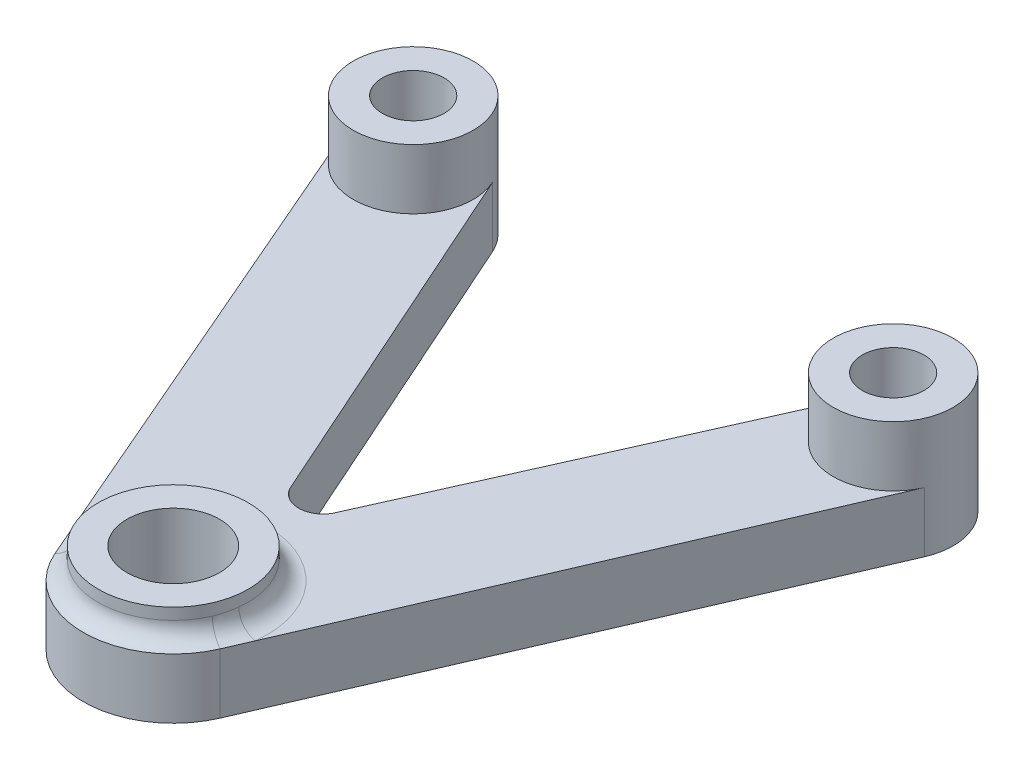
ISO-10303-21;
HEADER;
FILE_DESCRIPTION(('STEP AP214'),'2;1');
FILE_NAME('part.step','',(''),(''),'','','');
FILE_SCHEMA(('AUTOMOTIVE_DESIGN { 1 0 10303 214 1 1 1 1 }'));
ENDSEC;
DATA;
#1=APPLICATION_CONTEXT('core data for automotive mechanical design processes');
#2=APPLICATION_PROTOCOL_DEFINITION('international standard','automotive_design',2000,#1);
#3=PRODUCT_CONTEXT('',#1,'mechanical');
#4=PRODUCT('Part','Part','',(#3));
#5=PRODUCT_RELATED_PRODUCT_CATEGORY('part','',(#4));
#6=PRODUCT_DEFINITION_FORMATION('','',#4);
#7=PRODUCT_DEFINITION_CONTEXT('part definition',#1,'design');
#8=PRODUCT_DEFINITION('design','',#6,#7);
#9=PRODUCT_DEFINITION_SHAPE('','',#8);
#10=(LENGTH_UNIT() NAMED_UNIT(*) SI_UNIT(.MILLI.,.METRE.));
#11=(NAMED_UNIT(*) PLANE_ANGLE_UNIT() SI_UNIT($,.RADIAN.));
#12=(NAMED_UNIT(*) SI_UNIT($,.STERADIAN.) SOLID_ANGLE_UNIT());
#13=UNCERTAINTY_MEASURE_WITH_UNIT(LENGTH_MEASURE(1.E-05),#10,'distance_accuracy_value','');
#14=(GEOMETRIC_REPRESENTATION_CONTEXT(3) GLOBAL_UNCERTAINTY_ASSIGNED_CONTEXT((#13)) GLOBAL_UNIT_ASSIGNED_CONTEXT((#10,
#11,#12)) REPRESENTATION_CONTEXT('',''));
#15=CARTESIAN_POINT('',(0.,0.,0.));
#16=DIRECTION('',(0.,0.,1.));
#17=DIRECTION('',(1.,0.,0.));
#18=AXIS2_PLACEMENT_3D('',#15,#16,#17);
#19=CARTESIAN_POINT('',(0.,6.35,-19.1326419315339));
#20=DIRECTION('',(0.,-1.,0.));
#21=DIRECTION('',(0.,0.,-1.));
#22=AXIS2_PLACEMENT_3D('',#19,#20,#21);
#23=CYLINDRICAL_SURFACE('',#22,2.60351351052223);
#24=CARTESIAN_POINT('',(0.,0.,-19.1326419315339));
#25=DIRECTION('',(0.,1.,0.));
#26=DIRECTION('',(0.,0.,1.));
#27=AXIS2_PLACEMENT_3D('',#24,#25,#26);
#28=CIRCLE('',#27,2.60351351052223);
#29=CARTESIAN_POINT('',(-2.26024053048188,0.,-17.8405137088568));
#30=VERTEX_POINT('',#29);
#31=CARTESIAN_POINT('',(2.26024053048188,0.,-17.8405137088568));
#32=VERTEX_POINT('',#31);
#33=EDGE_CURVE('E253',#30,#32,#28,.T.);
#34=ORIENTED_EDGE('',*,*,#33,.F.);
#35=DIRECTION('',(0.,-1.,0.));
#36=VECTOR('',#35,1.);
#37=CARTESIAN_POINT('',(-2.26024053048188,6.35,-17.8405137088568));
#38=LINE('',#37,#36);
#39=CARTESIAN_POINT('',(-2.26024053048188,6.35,-17.8405137088568));
#40=VERTEX_POINT('',#39);
#41=EDGE_CURVE('E134',#40,#30,#38,.T.);
#42=ORIENTED_EDGE('',*,*,#41,.F.);
#43=CARTESIAN_POINT('',(0.,6.35,-19.1326419315339));
#44=DIRECTION('',(0.,1.,0.));
#45=DIRECTION('',(0.,0.,1.));
#46=AXIS2_PLACEMENT_3D('',#43,#44,#45);
#47=CIRCLE('',#46,2.60351351052223);
#48=CARTESIAN_POINT('',(2.26024053048188,6.35,-17.8405137088568));
#49=VERTEX_POINT('',#48);
#50=EDGE_CURVE('E141',#40,#49,#47,.T.);
#51=ORIENTED_EDGE('',*,*,#50,.T.);
#52=DIRECTION('',(0.,-1.,0.));
#53=VECTOR('',#52,1.);
#54=CARTESIAN_POINT('',(2.26024053048188,6.35,-17.8405137088568));
#55=LINE('',#54,#53);
#56=EDGE_CURVE('E254',#49,#32,#55,.T.);
#57=ORIENTED_EDGE('',*,*,#56,.T.);
#58=EDGE_LOOP('',(#34,#42,#51,#57));
#59=FACE_BOUND('',#58,.T.);
#60=ADVANCED_FACE('F39',(#59),#23,.F.);
#61=CARTESIAN_POINT('',(4.7614095283321,6.35,-2.12775872381943));
#62=DIRECTION('',(-0.912985825560001,0.,0.407991277267693));
#63=DIRECTION('',(0.407991277267693,0.,0.912985825560001));
#64=AXIS2_PLACEMENT_3D('',#61,#62,#63);
#65=PLANE('',#64);
#66=DIRECTION('',(-0.407991277267693,0.,-0.912985825560001));
#67=VECTOR('',#66,1.);
#68=CARTESIAN_POINT('',(4.7614095283321,0.,-2.12775872381943));
#69=LINE('',#68,#67);
#70=CARTESIAN_POINT('',(-19.602540007694,0.,-56.6483865421838));
#71=VERTEX_POINT('',#70);
#72=EDGE_CURVE('E130',#30,#71,#69,.T.);
#73=ORIENTED_EDGE('',*,*,#72,.T.);
#74=DIRECTION('',(0.,-1.,0.));
#75=VECTOR('',#74,1.);
#76=CARTESIAN_POINT('',(-19.602540007694,6.35,-56.6483865421838));
#77=LINE('',#76,#75);
#78=CARTESIAN_POINT('',(-19.602540007694,6.35,-56.6483865421838));
#79=VERTEX_POINT('',#78);
#80=EDGE_CURVE('E124',#79,#71,#77,.T.);
#81=ORIENTED_EDGE('',*,*,#80,.F.);
#82=DIRECTION('',(-0.407991277267693,0.,-0.912985825560001));
#83=VECTOR('',#82,1.);
#84=CARTESIAN_POINT('',(4.7614095283321,6.35,-2.12775872381943));
#85=LINE('',#84,#83);
#86=EDGE_CURVE('E127',#40,#79,#85,.T.);
#87=ORIENTED_EDGE('',*,*,#86,.F.);
#88=ORIENTED_EDGE('',*,*,#41,.T.);
#89=EDGE_LOOP('',(#73,#81,#87,#88));
#90=FACE_BOUND('',#89,.T.);
#91=ADVANCED_FACE('F126',(#90),#65,.F.);
#92=CARTESIAN_POINT('',(-25.4,6.35,-54.0576419315339));
#93=DIRECTION('',(0.,-1.,0.));
#94=DIRECTION('',(0.,0.,-1.));
#95=AXIS2_PLACEMENT_3D('',#92,#93,#94);
#96=CYLINDRICAL_SURFACE('',#95,6.35);
#97=ORIENTED_EDGE('',*,*,#80,.T.);
#98=CARTESIAN_POINT('',(-25.4,0.,-54.0576419315339));
#99=DIRECTION('',(0.,1.,0.));
#100=DIRECTION('',(0.,0.,1.));
#101=AXIS2_PLACEMENT_3D('',#98,#99,#100);
#102=CIRCLE('',#101,6.35);
#103=CARTESIAN_POINT('',(-31.2294813240886,0.,-51.5397762694896));
#104=VERTEX_POINT('',#103);
#105=EDGE_CURVE('E147',#71,#104,#102,.T.);
#106=ORIENTED_EDGE('',*,*,#105,.T.);
#107=DIRECTION('',(0.,-1.,0.));
#108=VECTOR('',#107,1.);
#109=CARTESIAN_POINT('',(-31.2294813240886,6.35,-51.5397762694896));
#110=LINE('',#109,#108);
#111=CARTESIAN_POINT('',(-31.2294813240886,6.35,-51.5397762694896));
#112=VERTEX_POINT('',#111);
#113=EDGE_CURVE('E135',#112,#104,#110,.T.);
#114=ORIENTED_EDGE('',*,*,#113,.F.);
#115=CARTESIAN_POINT('',(-25.4,6.35,-54.0576419315339));
#116=DIRECTION('',(0.,1.,0.));
#117=DIRECTION('',(0.,0.,1.));
#118=AXIS2_PLACEMENT_3D('',#115,#116,#117);
#119=CIRCLE('',#118,6.34999999999999);
#120=EDGE_CURVE('E11',#112,#79,#119,.T.);
#121=ORIENTED_EDGE('',*,*,#120,.T.);
#122=EDGE_LOOP('',(#97,#106,#114,#121));
#123=FACE_BOUND('',#122,.T.);
#124=CARTESIAN_POINT('',(-25.4,12.7,-54.0576419315339));
#125=DIRECTION('',(0.,1.,0.));
#126=DIRECTION('',(0.,0.,1.));
#127=AXIS2_PLACEMENT_3D('',#124,#125,#126);
#128=CIRCLE('',#127,6.34999999999999);
#129=CARTESIAN_POINT('',(-25.4,12.7,-47.7076419315339));
#130=VERTEX_POINT('',#129);
#131=EDGE_CURVE('E337',#130,#130,#128,.T.);
#132=ORIENTED_EDGE('',*,*,#131,.F.);
#133=EDGE_LOOP('',(#132));
#134=FACE_BOUND('',#133,.T.);
#135=ADVANCED_FACE('F145',(#123,#134),#96,.T.);
#136=CARTESIAN_POINT('',(-7.55840309085105,6.35,3.26462039147518));
#137=DIRECTION('',(0.918028554974588,0.,-0.396514277487294));
#138=DIRECTION('',(-0.396514277487294,0.,-0.918028554974588));
#139=AXIS2_PLACEMENT_3D('',#136,#137,#138);
#140=PLANE('',#139);
#141=DIRECTION('',(0.396514277487294,0.,0.918028554974588));
#142=VECTOR('',#141,1.);
#143=CARTESIAN_POINT('',(-7.55840309085105,0.,3.26462039147518));
#144=LINE('',#143,#142);
#145=CARTESIAN_POINT('',(-8.74422198613295,0.,0.519156561532535));
#146=VERTEX_POINT('',#145);
#147=EDGE_CURVE('E269',#104,#146,#144,.T.);
#148=ORIENTED_EDGE('',*,*,#147,.T.);
#149=DIRECTION('',(0.,-1.,0.));
#150=VECTOR('',#149,1.);
#151=CARTESIAN_POINT('',(-8.74422198613295,6.35,0.519156561532535));
#152=LINE('',#151,#150);
#153=CARTESIAN_POINT('',(-8.74422198613295,6.35,0.519156561532535));
#154=VERTEX_POINT('',#153);
#155=EDGE_CURVE('E151',#154,#146,#152,.T.);
#156=ORIENTED_EDGE('',*,*,#155,.F.);
#157=DIRECTION('',(0.396514277487294,0.,0.918028554974588));
#158=VECTOR('',#157,1.);
#159=CARTESIAN_POINT('',(-7.55840309085105,6.35,3.26462039147518));
#160=LINE('',#159,#158);
#161=CARTESIAN_POINT('',(-9.867714334644,6.35,-2.08200590798701));
#162=VERTEX_POINT('',#161);
#163=EDGE_CURVE('E142',#162,#154,#160,.T.);
#164=ORIENTED_EDGE('',*,*,#163,.F.);
#165=EDGE_CURVE('E320',#112,#162,#160,.T.);
#166=ORIENTED_EDGE('',*,*,#165,.F.);
#167=ORIENTED_EDGE('',*,*,#113,.T.);
#168=EDGE_LOOP('',(#148,#156,#164,#166,#167));
#169=FACE_BOUND('',#168,.T.);
#170=ADVANCED_FACE('F235',(#169),#140,.F.);
#171=CARTESIAN_POINT('',(0.,6.35,-3.25764193153394));
#172=DIRECTION('',(0.,-1.,0.));
#173=DIRECTION('',(0.,0.,-1.));
#174=AXIS2_PLACEMENT_3D('',#171,#172,#173);
#175=CYLINDRICAL_SURFACE('',#174,9.52500000000001);
#176=CARTESIAN_POINT('',(0.,0.,-3.25764193153394));
#177=DIRECTION('',(0.,1.,0.));
#178=DIRECTION('',(0.,0.,1.));
#179=AXIS2_PLACEMENT_3D('',#176,#177,#178);
#180=CIRCLE('',#179,9.52500000000001);
#181=CARTESIAN_POINT('',(8.74422198613295,0.,0.519156561532535));
#182=VERTEX_POINT('',#181);
#183=EDGE_CURVE('E271',#146,#182,#180,.T.);
#184=ORIENTED_EDGE('',*,*,#183,.T.);
#185=DIRECTION('',(0.,-1.,0.));
#186=VECTOR('',#185,1.);
#187=CARTESIAN_POINT('',(8.74422198613295,6.35,0.519156561532535));
#188=LINE('',#187,#186);
#189=CARTESIAN_POINT('',(8.74422198613295,6.35,0.519156561532535));
#190=VERTEX_POINT('',#189);
#191=EDGE_CURVE('E154',#190,#182,#188,.T.);
#192=ORIENTED_EDGE('',*,*,#191,.F.);
#193=CARTESIAN_POINT('',(0.,6.35,-3.25764193153394));
#194=DIRECTION('',(0.,1.,0.));
#195=DIRECTION('',(0.,0.,1.));
#196=AXIS2_PLACEMENT_3D('',#193,#194,#195);
#197=CIRCLE('',#196,9.52500000000001);
#198=EDGE_CURVE('E309',#154,#190,#197,.T.);
#199=ORIENTED_EDGE('',*,*,#198,.F.);
#200=ORIENTED_EDGE('',*,*,#155,.T.);
#201=EDGE_LOOP('',(#184,#192,#199,#200));
#202=FACE_BOUND('',#201,.T.);
#203=ADVANCED_FACE('F240',(#202),#175,.T.);
#204=CARTESIAN_POINT('',(7.55840309085105,6.35,3.26462039147518));
#205=DIRECTION('',(0.918028554974588,0.,0.396514277487294));
#206=DIRECTION('',(0.396514277487294,0.,-0.918028554974588));
#207=AXIS2_PLACEMENT_3D('',#204,#205,#206);
#208=PLANE('',#207);
#209=DIRECTION('',(-0.396514277487294,0.,0.918028554974588));
#210=VECTOR('',#209,1.);
#211=CARTESIAN_POINT('',(7.55840309085105,0.,3.26462039147518));
#212=LINE('',#211,#210);
#213=CARTESIAN_POINT('',(31.2294813240886,0.,-51.5397762694896));
#214=VERTEX_POINT('',#213);
#215=EDGE_CURVE('E274',#214,#182,#212,.T.);
#216=ORIENTED_EDGE('',*,*,#215,.F.);
#217=DIRECTION('',(0.,-1.,0.));
#218=VECTOR('',#217,1.);
#219=CARTESIAN_POINT('',(31.2294813240886,6.35,-51.5397762694896));
#220=LINE('',#219,#218);
#221=CARTESIAN_POINT('',(31.2294813240886,6.35,-51.5397762694896));
#222=VERTEX_POINT('',#221);
#223=EDGE_CURVE('E285',#222,#214,#220,.T.);
#224=ORIENTED_EDGE('',*,*,#223,.F.);
#225=DIRECTION('',(-0.396514277487294,0.,0.918028554974588));
#226=VECTOR('',#225,1.);
#227=CARTESIAN_POINT('',(7.55840309085105,6.35,3.26462039147518));
#228=LINE('',#227,#226);
#229=CARTESIAN_POINT('',(9.867714334644,6.35,-2.08200590798701));
#230=VERTEX_POINT('',#229);
#231=EDGE_CURVE('E301',#222,#230,#228,.T.);
#232=ORIENTED_EDGE('',*,*,#231,.T.);
#233=EDGE_CURVE('E292',#230,#190,#228,.T.);
#234=ORIENTED_EDGE('',*,*,#233,.T.);
#235=ORIENTED_EDGE('',*,*,#191,.T.);
#236=EDGE_LOOP('',(#216,#224,#232,#234,#235));
#237=FACE_BOUND('',#236,.T.);
#238=ADVANCED_FACE('F289',(#237),#208,.T.);
#239=CARTESIAN_POINT('',(25.4,6.35,-54.0576419315339));
#240=DIRECTION('',(0.,-1.,0.));
#241=DIRECTION('',(0.,0.,-1.));
#242=AXIS2_PLACEMENT_3D('',#239,#240,#241);
#243=CYLINDRICAL_SURFACE('',#242,6.35);
#244=ORIENTED_EDGE('',*,*,#223,.T.);
#245=CARTESIAN_POINT('',(25.4,0.,-54.0576419315339));
#246=DIRECTION('',(0.,1.,0.));
#247=DIRECTION('',(0.,0.,1.));
#248=AXIS2_PLACEMENT_3D('',#245,#246,#247);
#249=CIRCLE('',#248,6.35);
#250=CARTESIAN_POINT('',(19.602540007694,0.,-56.6483865421838));
#251=VERTEX_POINT('',#250);
#252=EDGE_CURVE('E277',#251,#214,#249,.F.);
#253=ORIENTED_EDGE('',*,*,#252,.F.);
#254=DIRECTION('',(0.,-1.,0.));
#255=VECTOR('',#254,1.);
#256=CARTESIAN_POINT('',(19.602540007694,6.35,-56.6483865421838));
#257=LINE('',#256,#255);
#258=CARTESIAN_POINT('',(19.602540007694,6.35,-56.6483865421838));
#259=VERTEX_POINT('',#258);
#260=EDGE_CURVE('E283',#259,#251,#257,.T.);
#261=ORIENTED_EDGE('',*,*,#260,.F.);
#262=CARTESIAN_POINT('',(25.4,6.35,-54.0576419315339));
#263=DIRECTION('',(0.,1.,0.));
#264=DIRECTION('',(0.,0.,1.));
#265=AXIS2_PLACEMENT_3D('',#262,#263,#264);
#266=CIRCLE('',#265,6.35);
#267=EDGE_CURVE('E47',#259,#222,#266,.T.);
#268=ORIENTED_EDGE('',*,*,#267,.T.);
#269=EDGE_LOOP('',(#244,#253,#261,#268));
#270=FACE_BOUND('',#269,.T.);
#271=CARTESIAN_POINT('',(25.4,12.7,-54.0576419315339));
#272=DIRECTION('',(0.,1.,0.));
#273=DIRECTION('',(0.,0.,1.));
#274=AXIS2_PLACEMENT_3D('',#271,#272,#273);
#275=CIRCLE('',#274,6.35);
#276=CARTESIAN_POINT('',(25.4,12.7,-47.7076419315339));
#277=VERTEX_POINT('',#276);
#278=EDGE_CURVE('E214',#277,#277,#275,.T.);
#279=ORIENTED_EDGE('',*,*,#278,.F.);
#280=EDGE_LOOP('',(#279));
#281=FACE_BOUND('',#280,.T.);
#282=ADVANCED_FACE('F298',(#270,#281),#243,.T.);
#283=CARTESIAN_POINT('',(-4.7614095283321,6.35,-2.12775872381943));
#284=DIRECTION('',(-0.912985825560001,0.,-0.407991277267693));
#285=DIRECTION('',(-0.407991277267693,0.,0.912985825560001));
#286=AXIS2_PLACEMENT_3D('',#283,#284,#285);
#287=PLANE('',#286);
#288=DIRECTION('',(0.407991277267693,0.,-0.912985825560001));
#289=VECTOR('',#288,1.);
#290=CARTESIAN_POINT('',(-4.7614095283321,0.,-2.12775872381943));
#291=LINE('',#290,#289);
#292=EDGE_CURVE('E280',#32,#251,#291,.T.);
#293=ORIENTED_EDGE('',*,*,#292,.F.);
#294=ORIENTED_EDGE('',*,*,#56,.F.);
#295=DIRECTION('',(0.407991277267693,0.,-0.912985825560001));
#296=VECTOR('',#295,1.);
#297=CARTESIAN_POINT('',(-4.7614095283321,6.35,-2.12775872381943));
#298=LINE('',#297,#296);
#299=EDGE_CURVE('E265',#49,#259,#298,.T.);
#300=ORIENTED_EDGE('',*,*,#299,.T.);
#301=ORIENTED_EDGE('',*,*,#260,.T.);
#302=EDGE_LOOP('',(#293,#294,#300,#301));
#303=FACE_BOUND('',#302,.T.);
#304=ADVANCED_FACE('F453',(#303),#287,.T.);
#305=CARTESIAN_POINT('',(0.,6.35,0.));
#306=DIRECTION('',(0.,1.,0.));
#307=DIRECTION('',(0.,0.,1.));
#308=AXIS2_PLACEMENT_3D('',#305,#306,#307);
#309=PLANE('',#308);
#310=ORIENTED_EDGE('',*,*,#120,.F.);
#311=ORIENTED_EDGE('',*,*,#165,.T.);
#312=CARTESIAN_POINT('',(0.,6.35,-3.25764193153394));
#313=DIRECTION('',(0.,1.,0.));
#314=DIRECTION('',(0.,0.,1.));
#315=AXIS2_PLACEMENT_3D('',#312,#313,#314);
#316=CIRCLE('',#315,9.9375);
#317=EDGE_CURVE('E54',#162,#230,#316,.F.);
#318=ORIENTED_EDGE('',*,*,#317,.T.);
#319=ORIENTED_EDGE('',*,*,#231,.F.);
#320=ORIENTED_EDGE('',*,*,#267,.F.);
#321=ORIENTED_EDGE('',*,*,#299,.F.);
#322=ORIENTED_EDGE('',*,*,#50,.F.);
#323=ORIENTED_EDGE('',*,*,#86,.T.);
#324=EDGE_LOOP('',(#310,#311,#318,#319,#320,#321,#322,#323));
#325=FACE_BOUND('',#324,.T.);
#326=ADVANCED_FACE('F137',(#325),#309,.T.);
#327=CARTESIAN_POINT('',(0.,0.,0.));
#328=DIRECTION('',(0.,1.,0.));
#329=DIRECTION('',(0.,0.,1.));
#330=AXIS2_PLACEMENT_3D('',#327,#328,#329);
#331=PLANE('',#330);
#332=CARTESIAN_POINT('',(0.,0.,-3.25764193153394));
#333=DIRECTION('',(0.,1.,0.));
#334=DIRECTION('',(0.,0.,1.));
#335=AXIS2_PLACEMENT_3D('',#332,#333,#334);
#336=CIRCLE('',#335,4.90219999999999);
#337=CARTESIAN_POINT('',(0.,0.,1.64455806846605));
#338=VERTEX_POINT('',#337);
#339=EDGE_CURVE('E314',#338,#338,#336,.T.);
#340=ORIENTED_EDGE('',*,*,#339,.T.);
#341=EDGE_LOOP('',(#340));
#342=FACE_BOUND('',#341,.T.);
#343=CARTESIAN_POINT('',(-25.4,0.,-54.0576419315339));
#344=DIRECTION('',(0.,1.,0.));
#345=DIRECTION('',(0.,0.,1.));
#346=AXIS2_PLACEMENT_3D('',#343,#344,#345);
#347=CIRCLE('',#346,3.2639);
#348=CARTESIAN_POINT('',(-25.4,0.,-50.7937419315339));
#349=VERTEX_POINT('',#348);
#350=EDGE_CURVE('E262',#349,#349,#347,.T.);
#351=ORIENTED_EDGE('',*,*,#350,.T.);
#352=EDGE_LOOP('',(#351));
#353=FACE_BOUND('',#352,.T.);
#354=CARTESIAN_POINT('',(25.4,0.,-54.0576419315339));
#355=DIRECTION('',(0.,1.,0.));
#356=DIRECTION('',(0.,0.,1.));
#357=AXIS2_PLACEMENT_3D('',#354,#355,#356);
#358=CIRCLE('',#357,3.2639);
#359=CARTESIAN_POINT('',(25.4,0.,-50.7937419315339));
#360=VERTEX_POINT('',#359);
#361=EDGE_CURVE('E258',#360,#360,#358,.T.);
#362=ORIENTED_EDGE('',*,*,#361,.T.);
#363=EDGE_LOOP('',(#362));
#364=FACE_BOUND('',#363,.T.);
#365=ORIENTED_EDGE('',*,*,#33,.T.);
#366=ORIENTED_EDGE('',*,*,#292,.T.);
#367=ORIENTED_EDGE('',*,*,#252,.T.);
#368=ORIENTED_EDGE('',*,*,#215,.T.);
#369=ORIENTED_EDGE('',*,*,#183,.F.);
#370=ORIENTED_EDGE('',*,*,#147,.F.);
#371=ORIENTED_EDGE('',*,*,#105,.F.);
#372=ORIENTED_EDGE('',*,*,#72,.F.);
#373=EDGE_LOOP('',(#365,#366,#367,#368,#369,#370,#371,#372));
#374=FACE_BOUND('',#373,.T.);
#375=ADVANCED_FACE('F296',(#342,#353,#364,#374),#331,.F.);
#376=CARTESIAN_POINT('',(25.4,6.35,-54.0576419315339));
#377=DIRECTION('',(0.,1.,0.));
#378=DIRECTION('',(0.,0.,1.));
#379=AXIS2_PLACEMENT_3D('',#376,#377,#378);
#380=CYLINDRICAL_SURFACE('',#379,3.2639);
#381=CARTESIAN_POINT('',(25.4,12.7,-54.0576419315339));
#382=DIRECTION('',(0.,1.,0.));
#383=DIRECTION('',(0.,0.,1.));
#384=AXIS2_PLACEMENT_3D('',#381,#382,#383);
#385=CIRCLE('',#384,3.2639);
#386=CARTESIAN_POINT('',(25.4,12.7,-50.7937419315339));
#387=VERTEX_POINT('',#386);
#388=EDGE_CURVE('E334',#387,#387,#385,.T.);
#389=ORIENTED_EDGE('',*,*,#388,.T.);
#390=EDGE_LOOP('',(#389));
#391=FACE_BOUND('',#390,.T.);
#392=ORIENTED_EDGE('',*,*,#361,.F.);
#393=EDGE_LOOP('',(#392));
#394=FACE_BOUND('',#393,.T.);
#395=ADVANCED_FACE('F376',(#391,#394),#380,.F.);
#396=CARTESIAN_POINT('',(-25.4,6.35,-54.0576419315339));
#397=DIRECTION('',(0.,1.,0.));
#398=DIRECTION('',(0.,0.,1.));
#399=AXIS2_PLACEMENT_3D('',#396,#397,#398);
#400=CYLINDRICAL_SURFACE('',#399,3.2639);
#401=CARTESIAN_POINT('',(-25.4,12.7,-54.0576419315339));
#402=DIRECTION('',(0.,1.,0.));
#403=DIRECTION('',(0.,0.,1.));
#404=AXIS2_PLACEMENT_3D('',#401,#402,#403);
#405=CIRCLE('',#404,3.2639);
#406=CARTESIAN_POINT('',(-25.4,12.7,-50.7937419315339));
#407=VERTEX_POINT('',#406);
#408=EDGE_CURVE('E340',#407,#407,#405,.T.);
#409=ORIENTED_EDGE('',*,*,#408,.T.);
#410=EDGE_LOOP('',(#409));
#411=FACE_BOUND('',#410,.T.);
#412=ORIENTED_EDGE('',*,*,#350,.F.);
#413=EDGE_LOOP('',(#412));
#414=FACE_BOUND('',#413,.T.);
#415=ADVANCED_FACE('F344',(#411,#414),#400,.F.);
#416=CARTESIAN_POINT('',(0.,9.525,-3.25764193153394));
#417=DIRECTION('',(0.,-1.,0.));
#418=DIRECTION('',(0.,0.,-1.));
#419=AXIS2_PLACEMENT_3D('',#416,#417,#418);
#420=CYLINDRICAL_SURFACE('',#419,7.9375);
#421=CARTESIAN_POINT('',(0.,8.35,-3.25764193153394));
#422=DIRECTION('',(0.,1.,0.));
#423=DIRECTION('',(0.,0.,1.));
#424=AXIS2_PLACEMENT_3D('',#421,#422,#423);
#425=CIRCLE('',#424,7.9375);
#426=CARTESIAN_POINT('',(7.88175924842634,8.35,-2.3186119001474));
#427=VERTEX_POINT('',#426);
#428=CARTESIAN_POINT('',(-7.88175924842634,8.35,-2.3186119001474));
#429=VERTEX_POINT('',#428);
#430=EDGE_CURVE('E159',#427,#429,#425,.T.);
#431=ORIENTED_EDGE('',*,*,#430,.T.);
#432=CARTESIAN_POINT('',(-7.92321061865644,8.34168497496145,-2.78157497992963));
#433=CARTESIAN_POINT('',(-7.91913868807956,6.163454674835,-2.71380559691229));
#434=CARTESIAN_POINT('',(-10.0868601345559,6.35,-2.5893825989268));
#435=CARTESIAN_POINT('',(-7.91669546929499,8.34589950342088,-2.67310379136009));
#436=CARTESIAN_POINT('',(-7.9131042779648,6.21341907660837,-2.62774990594332));
#437=CARTESIAN_POINT('',(-10.0361440329662,6.35,-2.47196228873919));
#438=CARTESIAN_POINT('',(-7.90794662079986,8.34829486296564,-2.56474024336233));
#439=CARTESIAN_POINT('',(-7.90529815447626,6.25889680312374,-2.53632754715262));
#440=CARTESIAN_POINT('',(-9.98503730748947,6.35,-2.35363758770654));
#441=CARTESIAN_POINT('',(-7.88600715792508,8.35040380857174,-2.34846714208903));
#442=CARTESIAN_POINT('',(-7.88566627573058,6.34063042595973,-2.34736387152889));
#443=CARTESIAN_POINT('',(-9.88215644335452,6.35,-2.11544295916792));
#444=CARTESIAN_POINT('',(-7.87281746369545,8.35011794985631,-2.2405574994495));
#445=CARTESIAN_POINT('',(-7.87389448177011,6.37717510325908,-2.24969767242746));
#446=CARTESIAN_POINT('',(-9.83038244509173,6.35,-1.99557335671212));
#447=CARTESIAN_POINT('',(-7.84202122626159,8.34782212550529,-2.0253998092539));
#448=CARTESIAN_POINT('',(-7.84580996391774,6.44235145610592,-2.05028102463539));
#449=CARTESIAN_POINT('',(-9.72626654989119,6.35,-1.75451932600602));
#450=CARTESIAN_POINT('',(-7.82441525759023,8.34581238405506,-1.91815167749699));
#451=CARTESIAN_POINT('',(-7.82953720351223,6.4711981551057,-1.94834464616127));
#452=CARTESIAN_POINT('',(-9.67392472767099,6.35,-1.63333507074527));
#453=CARTESIAN_POINT('',(-7.78481952756381,8.34085312705979,-1.70448384499291));
#454=CARTESIAN_POINT('',(-7.79221831870739,6.52217682757576,-1.74189023648997));
#455=CARTESIAN_POINT('',(-9.56875572359912,6.35,-1.3898428327153));
#456=CARTESIAN_POINT('',(-7.76282954840791,8.3379035648194,-1.59806418567789));
#457=CARTESIAN_POINT('',(-7.77119072331872,6.54446445080352,-1.63714895520172));
#458=CARTESIAN_POINT('',(-9.51592851775767,6.35,-1.26753479440381));
#459=CARTESIAN_POINT('',(-7.69160307763475,8.32886364594183,-1.28586860197355));
#460=CARTESIAN_POINT('',(-7.70229177367304,6.60141651347303,-1.32805420148421));
#461=CARTESIAN_POINT('',(-9.35963121630324,6.35,-0.905667911047432));
#462=CARTESIAN_POINT('',(-7.63628636185011,8.32244439072282,-1.08145042152646));
#463=CARTESIAN_POINT('',(-7.64711658146589,6.62899253376005,-1.11877734738483));
#464=CARTESIAN_POINT('',(-9.25558306147864,6.35,-0.664770716054334));
#465=CARTESIAN_POINT('',(-7.50949636172234,8.31244926514031,-0.677691024727496));
#466=CARTESIAN_POINT('',(-7.51830077946592,6.66741930252371,-0.702923726873053));
#467=CARTESIAN_POINT('',(-9.04662023880275,6.35,-0.180970134243739));
#468=CARTESIAN_POINT('',(-7.43802530349917,8.30887300330967,-0.478349113056965));
#469=CARTESIAN_POINT('',(-7.44429242472927,6.67864614601979,-0.4944131857377));
#470=CARTESIAN_POINT('',(-8.94170569226044,6.35,0.0619329717134883));
#471=CARTESIAN_POINT('',(-7.27759134540718,8.30624467153017,-0.0815779918430826));
#472=CARTESIAN_POINT('',(-7.27746303764007,6.68702707366524,-0.0806848052865282));
#473=CARTESIAN_POINT('',(-8.72930520060399,6.35,0.553692606869403));
#474=CARTESIAN_POINT('',(-7.18827125898213,8.30729614151715,0.115707415695912));
#475=CARTESIAN_POINT('',(-7.18350048928545,6.6839388206529,0.126367233187051));
#476=CARTESIAN_POINT('',(-8.62181448226827,6.35,0.802560187255787));
#477=CARTESIAN_POINT('',(-6.99380147766085,8.31367002836996,0.502341595259835));
#478=CARTESIAN_POINT('',(-6.98057424756784,6.66257354182981,0.527456274366948));
#479=CARTESIAN_POINT('',(-8.40733413152436,6.35,1.29913521025779));
#480=CARTESIAN_POINT('',(-6.88864837551744,8.31899336560701,0.691688647719607));
#481=CARTESIAN_POINT('',(-6.87052082186305,6.64408479237901,0.72334309865922));
#482=CARTESIAN_POINT('',(-8.30034461209605,6.35,1.54684239129706));
#483=CARTESIAN_POINT('',(-6.71808545993844,8.32810992233046,0.971258570971318));
#484=CARTESIAN_POINT('',(-6.69664084303055,6.60224305209462,1.0053975875876));
#485=CARTESIAN_POINT('',(-8.13936254789053,6.35,1.91955565830962));
#486=CARTESIAN_POINT('',(-6.65821047534579,8.33138865075115,1.06491466030385));
#487=CARTESIAN_POINT('',(-6.63573322142623,6.58542617568186,1.09950393271659));
#488=CARTESIAN_POINT('',(-8.08489484948495,6.35,2.04566184237174));
#489=CARTESIAN_POINT('',(-6.5345755249812,8.33769375367214,1.24963853909491));
#490=CARTESIAN_POINT('',(-6.51179069828715,6.54605623383036,1.28266453158733));
#491=CARTESIAN_POINT('',(-7.97637430510394,6.35,2.2969137245851));
#492=CARTESIAN_POINT('',(-6.47081562855001,8.34072013267427,1.34070637470798));
#493=CARTESIAN_POINT('',(-6.44856801290175,6.5233856138002,1.37190250775745));
#494=CARTESIAN_POINT('',(-7.92232145174343,6.35,2.42205943983464));
#495=CARTESIAN_POINT('',(-6.33952710403949,8.34581103222199,1.5200827181101));
#496=CARTESIAN_POINT('',(-6.32100654854449,6.47135197629328,1.54457589347108));
#497=CARTESIAN_POINT('',(-7.81473142260151,6.35,2.67115694928308));
#498=CARTESIAN_POINT('',(-6.27199901133334,8.34787568901831,1.60839161511334));
#499=CARTESIAN_POINT('',(-6.25647985730434,6.44182334118269,1.62816135252568));
#500=CARTESIAN_POINT('',(-7.76119417482549,6.35,2.7951089101673));
#501=CARTESIAN_POINT('',(-6.13328130206403,8.35015864871548,1.7821129986339));
#502=CARTESIAN_POINT('',(-6.12771818956425,6.37496267548846,1.78873933219677));
#503=CARTESIAN_POINT('',(-7.65471893231998,6.35,3.04162541302142));
#504=CARTESIAN_POINT('',(-6.06209132860346,8.35037677130347,1.86752520147983));
#505=CARTESIAN_POINT('',(-6.06331064635676,6.33740051713674,1.86583702347335));
#506=CARTESIAN_POINT('',(-7.60178099661699,6.35,3.16418981833042));
#507=CARTESIAN_POINT('',(-5.9891347469578,8.34922873114747,1.95140512457745));
#508=CARTESIAN_POINT('',(-6.00048889428218,6.29566015540645,1.93835062199185));
#509=CARTESIAN_POINT('',(-7.54919363073877,6.35,3.28594256784812));
#510=(BOUNDED_SURFACE() B_SPLINE_SURFACE(3,2,((#432,#433,#434),(#435,#436,#437),(#438,#439,
#440),(#441,#442,#443),(#444,#445,#446),(#447,#448,#449),(#450,#451,#452),(#453,#454,#455),
(#456,#457,#458),(#459,#460,#461),(#462,#463,#464),(#465,#466,#467),(#468,#469,#470),(#471,#472,
#473),(#474,#475,#476),(#477,#478,#479),(#480,#481,#482),(#483,#484,#485),(#486,#487,#488),
(#489,#490,#491),(#492,#493,#494),(#495,#496,#497),(#498,#499,#500),(#501,#502,#503),(#504,#505,
#506),(#507,#508,#509)),.UNSPECIFIED.,.F.,.F.,.F.) B_SPLINE_SURFACE_WITH_KNOTS((4,2,2,2,2,2,2,2,
2,2,2,2,4),(3,3),(0.,0.408263380677385,0.8164422205645,1.22456798616005,1.63271403279515,
2.42741439126504,3.22200530418352,4.03446351166703,4.8470968097908,5.26461703766217,
5.68212981550668,6.09958342476916,6.51707779763496),(0.,1.),
.UNSPECIFIED.) GEOMETRIC_REPRESENTATION_ITEM() RATIONAL_B_SPLINE_SURFACE(((1.,0.676150585185413,
1.),(1.,0.684050480555318,1.),(1.,0.691486421178658,1.),(1.,0.705427060470186,1.),(1.,
0.711931951655654,1.),(1.,0.724009647597399,1.),(1.,0.729582573440149,1.),(1.,0.739796999220544,
1.),(1.,0.744438452858975,1.),(1.,0.75674466269119,1.),(1.,0.763109423634441,1.),(1.,
0.772291998072278,1.),(1.,0.775110299929152,1.),(1.,0.777218114457058,1.),(1.,0.776426853216889,
1.),(1.,0.771131236278913,1.),(1.,0.766626080419051,1.),(1.,0.757006847537017,1.),(1.,
0.75325386983366,1.),(1.,0.744772217589826,1.),(1.,0.740043560460402,1.),(1.,0.729612125886046,
1.),(1.,0.723909486585314,1.),(1.,0.711529727985193,1.),(1.,0.704852513583941,1.),(1.,
0.697688620204205,1.))) REPRESENTATION_ITEM('') SURFACE());
#511=CARTESIAN_POINT('',(-7.92321061865644,8.34168497496145,-2.78157497992963));
#512=CARTESIAN_POINT('',(-7.91669546929499,8.34589950342088,-2.67310379136009));
#513=CARTESIAN_POINT('',(-7.90794662079986,8.34829486296564,-2.56474024336233));
#514=CARTESIAN_POINT('',(-7.88600715792508,8.35040380857174,-2.34846714208903));
#515=CARTESIAN_POINT('',(-7.87281746369545,8.35011794985631,-2.2405574994495));
#516=CARTESIAN_POINT('',(-7.84202122626159,8.34782212550529,-2.0253998092539));
#517=CARTESIAN_POINT('',(-7.82441525759023,8.34581238405506,-1.91815167749699));
#518=CARTESIAN_POINT('',(-7.78481952756381,8.34085312705979,-1.70448384499291));
#519=CARTESIAN_POINT('',(-7.76282954840791,8.3379035648194,-1.59806418567789));
#520=CARTESIAN_POINT('',(-7.69160307763475,8.32886364594183,-1.28586860197355));
#521=CARTESIAN_POINT('',(-7.63628636185011,8.32244439072282,-1.08145042152646));
#522=CARTESIAN_POINT('',(-7.50949636172234,8.31244926514031,-0.677691024727496));
#523=CARTESIAN_POINT('',(-7.43802530349917,8.30887300330967,-0.478349113056965));
#524=CARTESIAN_POINT('',(-7.27759134540718,8.30624467153017,-0.0815779918430826));
#525=CARTESIAN_POINT('',(-7.18827125898213,8.30729614151715,0.115707415695912));
#526=CARTESIAN_POINT('',(-6.99380147766085,8.31367002836996,0.502341595259835));
#527=CARTESIAN_POINT('',(-6.88864837551744,8.31899336560701,0.691688647719607));
#528=CARTESIAN_POINT('',(-6.71808545993844,8.32810992233046,0.971258570971318));
#529=CARTESIAN_POINT('',(-6.65821047534579,8.33138865075115,1.06491466030385));
#530=CARTESIAN_POINT('',(-6.5345755249812,8.33769375367214,1.24963853909491));
#531=CARTESIAN_POINT('',(-6.47081562855001,8.34072013267428,1.34070637470798));
#532=CARTESIAN_POINT('',(-6.33952710403949,8.34581103222199,1.5200827181101));
#533=CARTESIAN_POINT('',(-6.27199901133334,8.34787568901831,1.60839161511334));
#534=CARTESIAN_POINT('',(-6.13328130206403,8.35015864871548,1.7821129986339));
#535=CARTESIAN_POINT('',(-6.06209132860346,8.35037677130347,1.86752520147983));
#536=CARTESIAN_POINT('',(-5.9891347469578,8.34922873114747,1.95140512457745));
#537=B_SPLINE_CURVE_WITH_KNOTS('',3,(#511,#512,#513,#514,#515,#516,#517,#518,#519,#520,#521,
#522,#523,#524,#525,#526,#527,#528,#529,#530,#531,#532,#533,#534,#535,#536),.UNSPECIFIED.,.F.,
.F.,(4,2,2,2,2,2,2,2,2,2,2,2,4),(0.,0.408263380677385,0.8164422205645,1.22456798616005,
1.63271403279515,2.42741439126504,3.22200530418352,4.03446351166703,4.8470968097908,
5.26461703766217,5.68212981550668,6.09958342476916,6.51707779763496),.UNSPECIFIED.);
#538=CARTESIAN_POINT('',(-7.28685165511079,8.30699865866076,-0.110309853978547));
#539=VERTEX_POINT('',#538);
#540=EDGE_CURVE('E205',#429,#539,#537,.T.);
#541=ORIENTED_EDGE('',*,*,#540,.T.);
#542=CARTESIAN_POINT('',(0.,8.30699865866076,-3.25764193153394));
#543=DIRECTION('',(0.,-1.,0.));
#544=DIRECTION('',(0.,0.,-1.));
#545=AXIS2_PLACEMENT_3D('',#542,#543,#544);
#546=CIRCLE('',#545,7.9375);
#547=CARTESIAN_POINT('',(7.28685165511079,8.30699865866076,-0.110309853978548));
#548=VERTEX_POINT('',#547);
#549=EDGE_CURVE('E168',#539,#548,#546,.F.);
#550=ORIENTED_EDGE('',*,*,#549,.T.);
#551=CARTESIAN_POINT('',(5.77836728721352,8.34168497496146,2.1842674525022));
#552=CARTESIAN_POINT('',(5.82491342351387,6.16345467483504,2.13484349992168));
#553=CARTESIAN_POINT('',(7.40158383771003,6.35,3.62769572199177));
#554=CARTESIAN_POINT('',(5.85190391797342,8.34584580003975,2.10618752479129));
#555=CARTESIAN_POINT('',(5.88267445321084,6.21277697448066,2.07226672709852));
#556=CARTESIAN_POINT('',(7.45164214305776,6.35,3.51179837268554));
#557=CARTESIAN_POINT('',(5.92387265537298,8.34823309000176,2.02659503067063));
#558=CARTESIAN_POINT('',(5.9430612871247,6.25772798684561,2.00484962103917));
#559=CARTESIAN_POINT('',(7.50208114907337,6.35,3.39501960723906));
#560=CARTESIAN_POINT('',(6.0645231081151,8.35038268285854,1.86456103653696));
#561=CARTESIAN_POINT('',(6.06551719131487,6.33863117250017,1.8630626838184));
#562=CARTESIAN_POINT('',(7.60361052696073,6.35,3.15995400339738));
#563=CARTESIAN_POINT('',(6.1332055059948,8.3501455332185,1.7821201342864));
#564=CARTESIAN_POINT('',(6.12770866784947,6.37486210285997,1.78864908410679));
#565=CARTESIAN_POINT('',(7.65470076076358,6.35,3.04166748466578));
#566=CARTESIAN_POINT('',(6.26715556509454,8.34796941450472,1.61454184119046));
#567=CARTESIAN_POINT('',(6.25199786177544,6.43958675548998,1.63384704226807));
#568=CARTESIAN_POINT('',(7.75743794817896,6.35,2.80380550324415));
#569=CARTESIAN_POINT('',(6.3324235962674,8.34603063021256,1.52940474409415));
#570=CARTESIAN_POINT('',(6.31425155351649,6.46828873736107,1.55336498570154));
#571=CARTESIAN_POINT('',(7.80908484074211,6.35,2.68423018189852));
#572=CARTESIAN_POINT('',(6.45944820041443,8.34120892507649,1.35656880541962));
#573=CARTESIAN_POINT('',(6.4374475247139,6.51911187764373,1.38725926805885));
#574=CARTESIAN_POINT('',(7.91285490006254,6.35,2.44397684673175));
#575=CARTESIAN_POINT('',(6.5212045807526,8.33832595249649,1.26886982370471));
#576=CARTESIAN_POINT('',(6.49855808982355,6.54138458949753,1.30150266552639));
#577=CARTESIAN_POINT('',(7.96497809276616,6.35,2.32329877283843));
#578=CARTESIAN_POINT('',(6.70101175961956,8.32929006343969,1.00220376898419));
#579=CARTESIAN_POINT('',(6.67740857982224,6.59943018990336,1.03908193648886));
#580=CARTESIAN_POINT('',(8.12189909724623,6.35,1.95998786282306));
#581=CARTESIAN_POINT('',(6.81367899577905,8.32274726525155,0.819569476131635));
#582=CARTESIAN_POINT('',(6.79372767831421,6.62773730556529,0.853278868947388));
#583=CARTESIAN_POINT('',(8.22730847939942,6.35,1.71593909012291));
#584=CARTESIAN_POINT('',(7.02385700840739,8.31254706906597,0.445777890405123));
#585=CARTESIAN_POINT('',(7.01137895574837,6.66711969065752,0.469721216148373));
#586=CARTESIAN_POINT('',(8.43902805593163,6.35,1.2257559417748));
#587=CARTESIAN_POINT('',(7.12136940958554,8.3088893615941,0.254621513992412));
#588=CARTESIAN_POINT('',(7.11391640215893,6.67859067046175,0.270311930889083));
#589=CARTESIAN_POINT('',(8.54533815245708,6.35,0.979621792682042));
#590=CARTESIAN_POINT('',(7.30279337661357,8.30622548721444,-0.139733454364108));
#591=CARTESIAN_POINT('',(7.30341144111204,6.68709131107844,-0.140556119662134));
#592=CARTESIAN_POINT('',(8.7607691802722,6.35,0.48084571729054));
#593=CARTESIAN_POINT('',(7.38631586759485,8.30733477438356,-0.343111944838315));
#594=CARTESIAN_POINT('',(7.39091990586424,6.68384579152354,-0.354209422596811));
#595=CARTESIAN_POINT('',(8.86989551177834,6.35,0.228191288155966));
#596=CARTESIAN_POINT('',(7.53620910690834,8.31392437190775,-0.756096458100315));
#597=CARTESIAN_POINT('',(7.54555063281452,6.66167769034641,-0.783433481895125));
#598=CARTESIAN_POINT('',(9.08761012215607,6.35,-0.275871845278919));
#599=CARTESIAN_POINT('',(7.60257576049675,8.31940572451136,-0.96570395433711));
#600=CARTESIAN_POINT('',(7.61329393514885,6.64252830323112,-1.00116148621971));
#601=CARTESIAN_POINT('',(9.19619826651869,6.35,-0.527280238157759));
#602=CARTESIAN_POINT('',(7.71753123697706,8.33171155969442,-1.38905747949603));
#603=CARTESIAN_POINT('',(7.72791075493998,6.58507352529379,-1.43135736369698));
#604=CARTESIAN_POINT('',(9.4117612425246,6.35,-1.02636180622327));
#605=CARTESIAN_POINT('',(7.76616994153641,8.33853218926719,-1.6027900864475));
#606=CARTESIAN_POINT('',(7.77506704269907,6.54619190308826,-1.64595851475504));
#607=CARTESIAN_POINT('',(9.51873977601743,6.35,-1.2740435521066));
#608=CARTESIAN_POINT('',(7.84560218990749,8.34845044042322,-2.03357106965452));
#609=CARTESIAN_POINT('',(7.8498725954625,6.44279882557364,-2.0619526673573));
#610=CARTESIAN_POINT('',(9.73069531845534,6.35,-1.76477301984783));
#611=CARTESIAN_POINT('',(7.87640330883936,8.3515496429928,-2.25061799815919));
#612=CARTESIAN_POINT('',(7.87736292358953,6.37700343241233,-2.26518563940574));
#613=CARTESIAN_POINT('',(9.83567315869448,6.35,-2.00782266635692));
#614=CARTESIAN_POINT('',(7.90908442009455,8.34806556288441,-2.57768364640831));
#615=CARTESIAN_POINT('',(7.90631477103011,6.25364309017542,-2.54739972259732));
#616=CARTESIAN_POINT('',(9.99115997871981,6.35,-2.36781308488609));
#617=CARTESIAN_POINT('',(7.91772685098106,8.34554102438262,-2.68708301567207));
#618=CARTESIAN_POINT('',(7.9139858676053,6.20728992297329,-2.63940954340001));
#619=CARTESIAN_POINT('',(10.0427178127655,6.35,-2.48718221375212));
#620=CARTESIAN_POINT('',(7.93046479673855,8.33663479982955,-2.90600428393127));
#621=CARTESIAN_POINT('',(7.9261151631675,6.10439422486795,-2.81423924959157));
#622=CARTESIAN_POINT('',(10.1449943112117,6.35,-2.72397758634606));
#623=CARTESIAN_POINT('',(7.93456258710833,8.33025504655639,-3.0155260940972));
#624=CARTESIAN_POINT('',(7.93051435292747,6.04746056165961,-2.8970925702492));
#625=CARTESIAN_POINT('',(10.1957133830367,6.35,-2.84140477336232));
#626=CARTESIAN_POINT('',(7.93822086238251,8.31237337507576,-3.23448329639062));
#627=CARTESIAN_POINT('',(7.93726837814364,5.9219477397654,-3.05023836480297));
#628=CARTESIAN_POINT('',(10.2962190248338,6.35,-3.07410017512828));
#629=CARTESIAN_POINT('',(7.93777788018784,8.30086754927692,-3.34391855866748));
#630=CARTESIAN_POINT('',(7.93957340615588,5.85284604720482,-3.12038740399487));
#631=CARTESIAN_POINT('',(10.3460048531689,6.35,-3.18936667280478));
#632=CARTESIAN_POINT('',(7.93240976695676,8.27114713451988,-3.56222229865222));
#633=CARTESIAN_POINT('',(7.94409635755353,5.70220536819428,-3.24320546827016));
#634=CARTESIAN_POINT('',(10.4444359471059,6.35,-3.41725898352854));
#635=CARTESIAN_POINT('',(7.92747909842856,8.25292427374269,-3.6710899089608));
#636=CARTESIAN_POINT('',(7.94631791358727,5.62002099204908,-3.29545638067835));
#637=CARTESIAN_POINT('',(10.4930797274131,6.35,-3.52988135775137));
#638=CARTESIAN_POINT('',(7.9203369998525,8.2305613973738,-3.77933921805887));
#639=CARTESIAN_POINT('',(7.9496088782263,5.53267520913684,-3.33493755577789));
#640=CARTESIAN_POINT('',(10.5410064331893,6.35,-3.64084352720285));
#641=(BOUNDED_SURFACE() B_SPLINE_SURFACE(3,2,((#551,#552,#553),(#554,#555,#556),(#557,#558,
#559),(#560,#561,#562),(#563,#564,#565),(#566,#567,#568),(#569,#570,#571),(#572,#573,#574),
(#575,#576,#577),(#578,#579,#580),(#581,#582,#583),(#584,#585,#586),(#587,#588,#589),(#590,#591,
#592),(#593,#594,#595),(#596,#597,#598),(#599,#600,#601),(#602,#603,#604),(#605,#606,#607),
(#608,#609,#610),(#611,#612,#613),(#614,#615,#616),(#617,#618,#619),(#620,#621,#622),(#623,#624,
#625),(#626,#627,#628),(#629,#630,#631),(#632,#633,#634),(#635,#636,#637),(#638,#639,#640)),
.UNSPECIFIED.,.F.,.F.,.F.) B_SPLINE_SURFACE_WITH_KNOTS((4,2,2,2,2,2,2,2,2,2,2,2,2,2,4),(3,3),
(0.,0.402970056238673,0.805856053420443,1.20869830637134,1.61156263646098,2.41682091324911,
3.22199280081303,4.04677401263628,4.8717519013018,5.69439027026357,6.51667903121739,
6.92878438184874,7.34068329828788,7.75289674284738,8.1656195206373),(0.,1.),
.UNSPECIFIED.) GEOMETRIC_REPRESENTATION_ITEM() RATIONAL_B_SPLINE_SURFACE(((1.,0.67615058518542,
1.),(1.,0.683948020420389,1.),(1.,0.691293474911979,1.),(1.,0.705077137130814,1.),(1.,
0.71151553378899,1.),(1.,0.723484399827839,1.),(1.,0.729014967712804,1.),(1.,0.739168680467843,
1.),(1.,0.743791775591409,1.),(1.,0.75629500273898,1.),(1.,0.762816063157839,1.),(1.,
0.772216602683768,1.),(1.,0.775096472389678,1.),(1.,0.777234225621822,1.),(1.,0.776402190410535,
1.),(1.,0.770912182464813,1.),(1.,0.766253297446881,1.),(1.,0.75314020583548,1.),(1.,
0.744696799700193,1.),(1.,0.724025394513664,1.),(1.,0.711799005378203,1.),(1.,0.690616937474479,
1.),(1.,0.683072051424603,1.),(1.,0.667042969701092,1.),(1.,0.658559246445071,1.),(1.,
0.640653275479209,1.),(1.,0.63123031605409,1.),(1.,0.611470917600198,1.),(1.,0.601133364257164,
1.),(1.,0.590360032919318,1.))) REPRESENTATION_ITEM('') SURFACE());
#642=CARTESIAN_POINT('',(5.77836728721352,8.34168497496146,2.1842674525022));
#643=CARTESIAN_POINT('',(5.85190391797342,8.34584580003975,2.10618752479129));
#644=CARTESIAN_POINT('',(5.92387265537298,8.34823309000176,2.02659503067063));
#645=CARTESIAN_POINT('',(6.0645231081151,8.35038268285854,1.86456103653696));
#646=CARTESIAN_POINT('',(6.1332055059948,8.3501455332185,1.7821201342864));
#647=CARTESIAN_POINT('',(6.26715556509454,8.34796941450472,1.61454184119046));
#648=CARTESIAN_POINT('',(6.3324235962674,8.34603063021256,1.52940474409415));
#649=CARTESIAN_POINT('',(6.45944820041443,8.34120892507649,1.35656880541962));
#650=CARTESIAN_POINT('',(6.5212045807526,8.33832595249649,1.26886982370471));
#651=CARTESIAN_POINT('',(6.70101175961956,8.32929006343969,1.00220376898419));
#652=CARTESIAN_POINT('',(6.81367899577905,8.32274726525155,0.819569476131635));
#653=CARTESIAN_POINT('',(7.02385700840739,8.31254706906597,0.445777890405123));
#654=CARTESIAN_POINT('',(7.12136940958554,8.3088893615941,0.254621513992412));
#655=CARTESIAN_POINT('',(7.30279337661357,8.30622548721444,-0.139733454364108));
#656=CARTESIAN_POINT('',(7.38631586759485,8.30733477438356,-0.343111944838315));
#657=CARTESIAN_POINT('',(7.53620910690834,8.31392437190775,-0.756096458100315));
#658=CARTESIAN_POINT('',(7.60257576049675,8.31940572451136,-0.965703954337109));
#659=CARTESIAN_POINT('',(7.71753123697707,8.33171155969442,-1.38905747949603));
#660=CARTESIAN_POINT('',(7.76616994153641,8.33853218926719,-1.6027900864475));
#661=CARTESIAN_POINT('',(7.84560218990749,8.34845044042322,-2.03357106965452));
#662=CARTESIAN_POINT('',(7.87640330883936,8.3515496429928,-2.25061799815919));
#663=CARTESIAN_POINT('',(7.90908442009455,8.34806556288441,-2.57768364640831));
#664=CARTESIAN_POINT('',(7.91772685098106,8.34554102438262,-2.68708301567207));
#665=CARTESIAN_POINT('',(7.93046479673855,8.33663479982956,-2.90600428393127));
#666=CARTESIAN_POINT('',(7.93456258710833,8.33025504655639,-3.0155260940972));
#667=CARTESIAN_POINT('',(7.93822086238251,8.31237337507576,-3.23448329639062));
#668=CARTESIAN_POINT('',(7.93777788018784,8.30086754927692,-3.34391855866748));
#669=CARTESIAN_POINT('',(7.93240976695676,8.27114713451988,-3.56222229865222));
#670=CARTESIAN_POINT('',(7.92747909842856,8.25292427374269,-3.6710899089608));
#671=CARTESIAN_POINT('',(7.9203369998525,8.2305613973738,-3.77933921805887));
#672=B_SPLINE_CURVE_WITH_KNOTS('',3,(#642,#643,#644,#645,#646,#647,#648,#649,#650,#651,#652,
#653,#654,#655,#656,#657,#658,#659,#660,#661,#662,#663,#664,#665,#666,#667,#668,#669,#670,#671),
.UNSPECIFIED.,.F.,.F.,(4,2,2,2,2,2,2,2,2,2,2,2,2,2,4),(0.,0.402970056238673,0.805856053420443,
1.20869830637134,1.61156263646098,2.41682091324911,3.22199280081303,4.04677401263628,
4.8717519013018,5.69439027026357,6.51667903121739,6.92878438184874,7.34068329828788,
7.75289674284738,8.1656195206373),.UNSPECIFIED.);
#673=EDGE_CURVE('E161',#548,#427,#672,.T.);
#674=ORIENTED_EDGE('',*,*,#673,.T.);
#675=EDGE_LOOP('',(#431,#541,#550,#674));
#676=FACE_BOUND('',#675,.T.);
#677=CARTESIAN_POINT('',(0.,9.525,-3.25764193153394));
#678=DIRECTION('',(0.,1.,0.));
#679=DIRECTION('',(0.,0.,1.));
#680=AXIS2_PLACEMENT_3D('',#677,#678,#679);
#681=CIRCLE('',#680,7.9375);
#682=CARTESIAN_POINT('',(0.,9.525,4.67985806846606));
#683=VERTEX_POINT('',#682);
#684=EDGE_CURVE('E327',#683,#683,#681,.T.);
#685=ORIENTED_EDGE('',*,*,#684,.F.);
#686=EDGE_LOOP('',(#685));
#687=FACE_BOUND('',#686,.T.);
#688=ADVANCED_FACE('F170',(#676,#687),#420,.T.);
#689=CARTESIAN_POINT('',(0.,9.525,0.));
#690=DIRECTION('',(0.,1.,0.));
#691=DIRECTION('',(0.,0.,1.));
#692=AXIS2_PLACEMENT_3D('',#689,#690,#691);
#693=PLANE('',#692);
#694=CARTESIAN_POINT('',(0.,9.525,-3.25764193153394));
#695=DIRECTION('',(0.,1.,0.));
#696=DIRECTION('',(0.,0.,1.));
#697=AXIS2_PLACEMENT_3D('',#694,#695,#696);
#698=CIRCLE('',#697,4.90219999999999);
#699=CARTESIAN_POINT('',(0.,9.525,1.64455806846605));
#700=VERTEX_POINT('',#699);
#701=EDGE_CURVE('E312',#700,#700,#698,.T.);
#702=ORIENTED_EDGE('',*,*,#701,.F.);
#703=EDGE_LOOP('',(#702));
#704=FACE_BOUND('',#703,.T.);
#705=ORIENTED_EDGE('',*,*,#684,.T.);
#706=EDGE_LOOP('',(#705));
#707=FACE_BOUND('',#706,.T.);
#708=ADVANCED_FACE('F359',(#704,#707),#693,.T.);
#709=CARTESIAN_POINT('',(0.,9.525,-3.25764193153394));
#710=DIRECTION('',(0.,1.,0.));
#711=DIRECTION('',(0.,0.,1.));
#712=AXIS2_PLACEMENT_3D('',#709,#710,#711);
#713=CYLINDRICAL_SURFACE('',#712,4.90219999999999);
#714=ORIENTED_EDGE('',*,*,#339,.F.);
#715=EDGE_LOOP('',(#714));
#716=FACE_BOUND('',#715,.T.);
#717=ORIENTED_EDGE('',*,*,#701,.T.);
#718=EDGE_LOOP('',(#717));
#719=FACE_BOUND('',#718,.T.);
#720=ADVANCED_FACE('F188',(#716,#719),#713,.F.);
#721=CARTESIAN_POINT('',(9.12290876505997,8.30699865866076,0.682718700996039));
#722=DIRECTION('',(-0.396514277487294,0.,0.918028554974588));
#723=DIRECTION('',(0.918028554974588,0.,0.396514277487294));
#724=AXIS2_PLACEMENT_3D('',#721,#722,#723);
#725=CIRCLE('',#724,2.);
#726=EDGE_CURVE('E216',#190,#548,#725,.F.);
#727=ORIENTED_EDGE('',*,*,#726,.F.);
#728=ORIENTED_EDGE('',*,*,#233,.F.);
#729=CARTESIAN_POINT('',(9.867714334644,8.35,-2.08200590798701));
#730=DIRECTION('',(-0.118302996080194,0.,0.992977543108831));
#731=DIRECTION('',(0.992977543108831,0.,0.118302996080194));
#732=AXIS2_PLACEMENT_3D('',#729,#730,#731);
#733=CIRCLE('',#732,2.);
#734=EDGE_CURVE('E305',#427,#230,#733,.T.);
#735=ORIENTED_EDGE('',*,*,#734,.F.);
#736=ORIENTED_EDGE('',*,*,#673,.F.);
#737=EDGE_LOOP('',(#727,#728,#735,#736));
#738=FACE_BOUND('',#737,.T.);
#739=ADVANCED_FACE('F181',(#738),#641,.F.);
#740=CARTESIAN_POINT('',(0.,8.35,-3.25764193153394));
#741=DIRECTION('',(0.,1.,0.));
#742=DIRECTION('',(0.,0.,1.));
#743=AXIS2_PLACEMENT_3D('',#740,#741,#742);
#744=TOROIDAL_SURFACE('',#743,9.9375,2.);
#745=ORIENTED_EDGE('',*,*,#734,.T.);
#746=ORIENTED_EDGE('',*,*,#317,.F.);
#747=CARTESIAN_POINT('',(-9.867714334644,8.35,-2.08200590798701));
#748=DIRECTION('',(-0.118302996080195,0.,-0.992977543108831));
#749=DIRECTION('',(-0.992977543108831,0.,0.118302996080195));
#750=AXIS2_PLACEMENT_3D('',#747,#748,#749);
#751=CIRCLE('',#750,2.);
#752=EDGE_CURVE('E62',#429,#162,#751,.T.);
#753=ORIENTED_EDGE('',*,*,#752,.F.);
#754=ORIENTED_EDGE('',*,*,#430,.F.);
#755=EDGE_LOOP('',(#745,#746,#753,#754));
#756=FACE_BOUND('',#755,.T.);
#757=ADVANCED_FACE('F187',(#756),#744,.F.);
#758=CARTESIAN_POINT('',(0.,8.30699865866076,-3.25764193153394));
#759=DIRECTION('',(0.,-1.,0.));
#760=DIRECTION('',(0.,0.,-1.));
#761=AXIS2_PLACEMENT_3D('',#758,#759,#760);
#762=TOROIDAL_SURFACE('',#761,9.9375,2.);
#763=ORIENTED_EDGE('',*,*,#726,.T.);
#764=ORIENTED_EDGE('',*,*,#549,.F.);
#765=CARTESIAN_POINT('',(-9.12290876505996,8.30699865866076,0.682718700996041));
#766=DIRECTION('',(0.396514277487294,0.,0.918028554974587));
#767=DIRECTION('',(0.918028554974587,0.,-0.396514277487294));
#768=AXIS2_PLACEMENT_3D('',#765,#766,#767);
#769=CIRCLE('',#768,2.);
#770=EDGE_CURVE('E212',#154,#539,#769,.T.);
#771=ORIENTED_EDGE('',*,*,#770,.F.);
#772=ORIENTED_EDGE('',*,*,#198,.T.);
#773=EDGE_LOOP('',(#763,#764,#771,#772));
#774=FACE_BOUND('',#773,.T.);
#775=ADVANCED_FACE('F318',(#774),#762,.F.);
#776=ORIENTED_EDGE('',*,*,#752,.T.);
#777=ORIENTED_EDGE('',*,*,#163,.T.);
#778=ORIENTED_EDGE('',*,*,#770,.T.);
#779=ORIENTED_EDGE('',*,*,#540,.F.);
#780=EDGE_LOOP('',(#776,#777,#778,#779));
#781=FACE_BOUND('',#780,.T.);
#782=ADVANCED_FACE('F229',(#781),#510,.F.);
#783=CARTESIAN_POINT('',(25.4,12.7,-54.0576419315339));
#784=DIRECTION('',(0.,1.,0.));
#785=DIRECTION('',(0.,0.,1.));
#786=AXIS2_PLACEMENT_3D('',#783,#784,#785);
#787=PLANE('',#786);
#788=ORIENTED_EDGE('',*,*,#278,.T.);
#789=EDGE_LOOP('',(#788));
#790=FACE_BOUND('',#789,.T.);
#791=ORIENTED_EDGE('',*,*,#388,.F.);
#792=EDGE_LOOP('',(#791));
#793=FACE_BOUND('',#792,.T.);
#794=ADVANCED_FACE('F349',(#790,#793),#787,.T.);
#795=CARTESIAN_POINT('',(-25.4,12.7,-54.0576419315339));
#796=DIRECTION('',(0.,1.,0.));
#797=DIRECTION('',(0.,0.,1.));
#798=AXIS2_PLACEMENT_3D('',#795,#796,#797);
#799=PLANE('',#798);
#800=ORIENTED_EDGE('',*,*,#131,.T.);
#801=EDGE_LOOP('',(#800));
#802=FACE_BOUND('',#801,.T.);
#803=ORIENTED_EDGE('',*,*,#408,.F.);
#804=EDGE_LOOP('',(#803));
#805=FACE_BOUND('',#804,.T.);
#806=ADVANCED_FACE('F347',(#802,#805),#799,.T.);
#807=CLOSED_SHELL('',(#60,#91,#135,#170,#203,#238,#282,#304,#326,#375,#395,#415,#688,#708,#720,
#739,#757,#775,#782,#794,#806));
#808=MANIFOLD_SOLID_BREP('B2',#807);
#809=ADVANCED_BREP_SHAPE_REPRESENTATION('',(#18,#808),#14);
#810=SHAPE_DEFINITION_REPRESENTATION(#9,#809);
ENDSEC;
END-ISO-10303-21;
